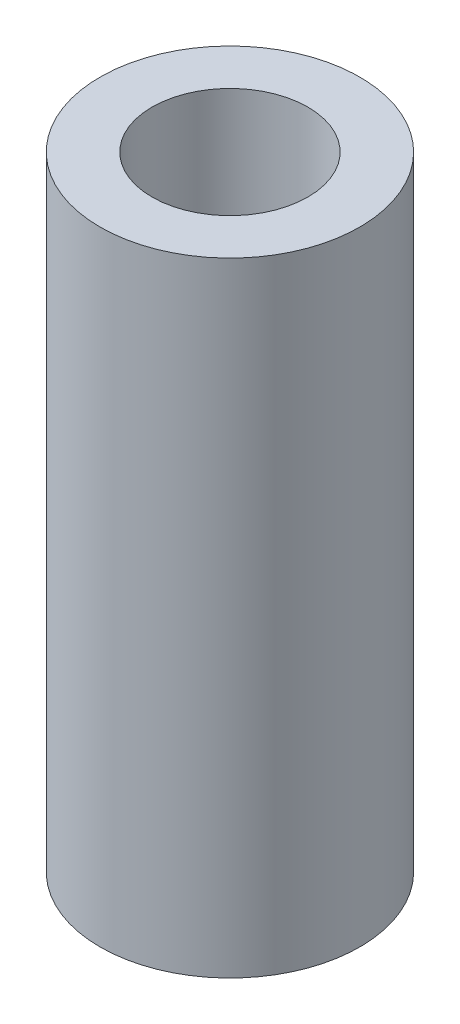
ISO-10303-21;
HEADER;
FILE_DESCRIPTION(('STEP AP214'),'2;1');
FILE_NAME('part.step','',(''),(''),'','','');
FILE_SCHEMA(('AUTOMOTIVE_DESIGN { 1 0 10303 214 1 1 1 1 }'));
ENDSEC;
DATA;
#1=APPLICATION_CONTEXT('core data for automotive mechanical design processes');
#2=APPLICATION_PROTOCOL_DEFINITION('international standard','automotive_design',2000,#1);
#3=PRODUCT_CONTEXT('',#1,'mechanical');
#4=PRODUCT('Part','Part','',(#3));
#5=PRODUCT_RELATED_PRODUCT_CATEGORY('part','',(#4));
#6=PRODUCT_DEFINITION_FORMATION('','',#4);
#7=PRODUCT_DEFINITION_CONTEXT('part definition',#1,'design');
#8=PRODUCT_DEFINITION('design','',#6,#7);
#9=PRODUCT_DEFINITION_SHAPE('','',#8);
#10=(LENGTH_UNIT() NAMED_UNIT(*) SI_UNIT(.MILLI.,.METRE.));
#11=(NAMED_UNIT(*) PLANE_ANGLE_UNIT() SI_UNIT($,.RADIAN.));
#12=(NAMED_UNIT(*) SI_UNIT($,.STERADIAN.) SOLID_ANGLE_UNIT());
#13=UNCERTAINTY_MEASURE_WITH_UNIT(LENGTH_MEASURE(1.E-05),#10,'distance_accuracy_value','');
#14=(GEOMETRIC_REPRESENTATION_CONTEXT(3) GLOBAL_UNCERTAINTY_ASSIGNED_CONTEXT((#13)) GLOBAL_UNIT_ASSIGNED_CONTEXT((#10,
#11,#12)) REPRESENTATION_CONTEXT('',''));
#15=CARTESIAN_POINT('',(0.,0.,0.));
#16=DIRECTION('',(0.,0.,1.));
#17=DIRECTION('',(1.,0.,0.));
#18=AXIS2_PLACEMENT_3D('',#15,#16,#17);
#19=CARTESIAN_POINT('',(0.,12.,0.));
#20=DIRECTION('',(0.,1.,0.));
#21=DIRECTION('',(0.,0.,1.));
#22=AXIS2_PLACEMENT_3D('',#19,#20,#21);
#23=PLANE('',#22);
#24=CARTESIAN_POINT('',(0.,12.,0.));
#25=DIRECTION('',(0.,1.,0.));
#26=DIRECTION('',(0.,0.,1.));
#27=AXIS2_PLACEMENT_3D('',#24,#25,#26);
#28=CIRCLE('',#27,2.5);
#29=CARTESIAN_POINT('',(0.,12.,2.5));
#30=VERTEX_POINT('',#29);
#31=EDGE_CURVE('E10',#30,#30,#28,.T.);
#32=ORIENTED_EDGE('',*,*,#31,.T.);
#33=EDGE_LOOP('',(#32));
#34=FACE_BOUND('',#33,.T.);
#35=CARTESIAN_POINT('',(0.,12.,0.));
#36=DIRECTION('',(0.,1.,0.));
#37=DIRECTION('',(0.,0.,1.));
#38=AXIS2_PLACEMENT_3D('',#35,#36,#37);
#39=CIRCLE('',#38,1.5);
#40=CARTESIAN_POINT('',(0.,12.,1.5));
#41=VERTEX_POINT('',#40);
#42=EDGE_CURVE('E51',#41,#41,#39,.T.);
#43=ORIENTED_EDGE('',*,*,#42,.F.);
#44=EDGE_LOOP('',(#43));
#45=FACE_BOUND('',#44,.T.);
#46=ADVANCED_FACE('F38',(#34,#45),#23,.T.);
#47=CARTESIAN_POINT('',(0.,0.,0.));
#48=DIRECTION('',(0.,1.,0.));
#49=DIRECTION('',(0.,0.,1.));
#50=AXIS2_PLACEMENT_3D('',#47,#48,#49);
#51=PLANE('',#50);
#52=CARTESIAN_POINT('',(0.,0.,0.));
#53=DIRECTION('',(0.,1.,0.));
#54=DIRECTION('',(0.,0.,1.));
#55=AXIS2_PLACEMENT_3D('',#52,#53,#54);
#56=CIRCLE('',#55,2.5);
#57=CARTESIAN_POINT('',(0.,0.,2.5));
#58=VERTEX_POINT('',#57);
#59=EDGE_CURVE('E42',#58,#58,#56,.T.);
#60=ORIENTED_EDGE('',*,*,#59,.F.);
#61=EDGE_LOOP('',(#60));
#62=FACE_BOUND('',#61,.T.);
#63=CARTESIAN_POINT('',(0.,0.,0.));
#64=DIRECTION('',(0.,1.,0.));
#65=DIRECTION('',(0.,0.,1.));
#66=AXIS2_PLACEMENT_3D('',#63,#64,#65);
#67=CIRCLE('',#66,1.5);
#68=CARTESIAN_POINT('',(0.,0.,1.5));
#69=VERTEX_POINT('',#68);
#70=EDGE_CURVE('E53',#69,#69,#67,.T.);
#71=ORIENTED_EDGE('',*,*,#70,.T.);
#72=EDGE_LOOP('',(#71));
#73=FACE_BOUND('',#72,.T.);
#74=ADVANCED_FACE('F65',(#62,#73),#51,.F.);
#75=CARTESIAN_POINT('',(0.,12.,0.));
#76=DIRECTION('',(0.,-1.,0.));
#77=DIRECTION('',(0.,0.,-1.));
#78=AXIS2_PLACEMENT_3D('',#75,#76,#77);
#79=CYLINDRICAL_SURFACE('',#78,2.5);
#80=ORIENTED_EDGE('',*,*,#31,.F.);
#81=EDGE_LOOP('',(#80));
#82=FACE_BOUND('',#81,.T.);
#83=ORIENTED_EDGE('',*,*,#59,.T.);
#84=EDGE_LOOP('',(#83));
#85=FACE_BOUND('',#84,.T.);
#86=ADVANCED_FACE('F40',(#82,#85),#79,.T.);
#87=CARTESIAN_POINT('',(0.,12.,0.));
#88=DIRECTION('',(0.,-1.,0.));
#89=DIRECTION('',(0.,0.,-1.));
#90=AXIS2_PLACEMENT_3D('',#87,#88,#89);
#91=CYLINDRICAL_SURFACE('',#90,1.5);
#92=ORIENTED_EDGE('',*,*,#42,.T.);
#93=EDGE_LOOP('',(#92));
#94=FACE_BOUND('',#93,.T.);
#95=ORIENTED_EDGE('',*,*,#70,.F.);
#96=EDGE_LOOP('',(#95));
#97=FACE_BOUND('',#96,.T.);
#98=ADVANCED_FACE('F61',(#94,#97),#91,.F.);
#99=CLOSED_SHELL('',(#46,#74,#86,#98));
#100=MANIFOLD_SOLID_BREP('B2',#99);
#101=ADVANCED_BREP_SHAPE_REPRESENTATION('',(#18,#100),#14);
#102=SHAPE_DEFINITION_REPRESENTATION(#9,#101);
ENDSEC;
END-ISO-10303-21;
